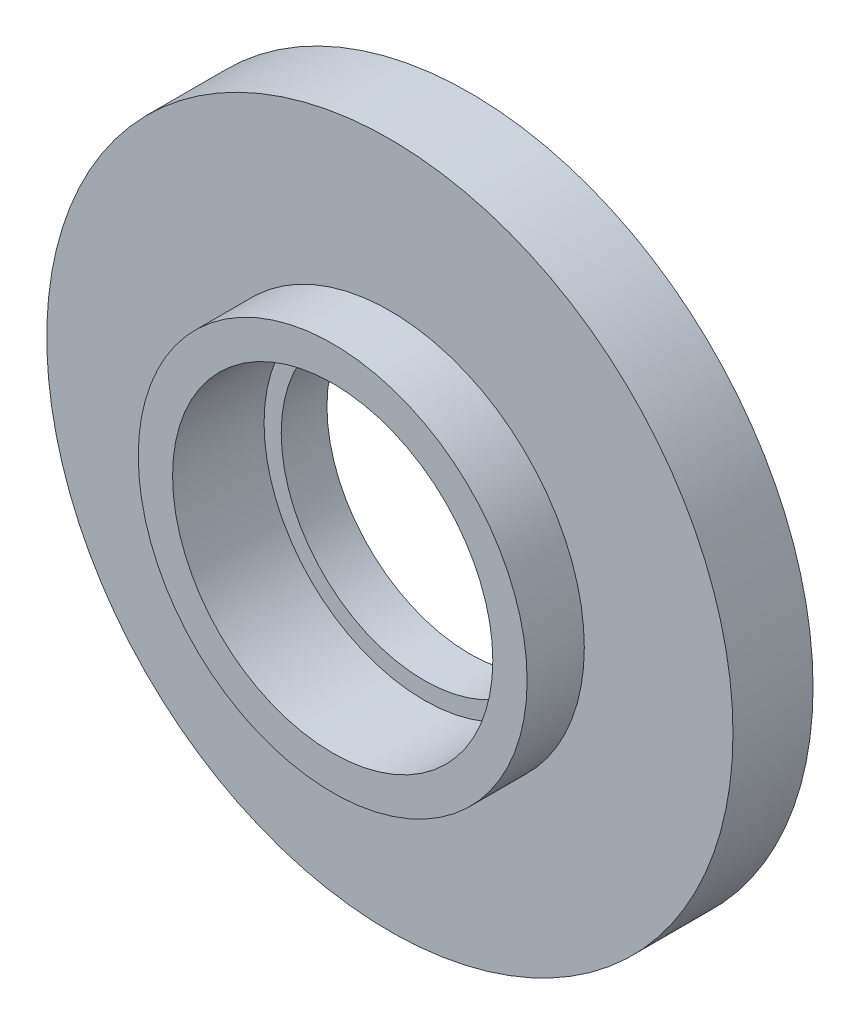
ISO-10303-21;
HEADER;
FILE_DESCRIPTION(('STEP AP214'),'2;1');
FILE_NAME('part.step','',(''),(''),'','','');
FILE_SCHEMA(('AUTOMOTIVE_DESIGN { 1 0 10303 214 1 1 1 1 }'));
ENDSEC;
DATA;
#1=APPLICATION_CONTEXT('core data for automotive mechanical design processes');
#2=APPLICATION_PROTOCOL_DEFINITION('international standard','automotive_design',2000,#1);
#3=PRODUCT_CONTEXT('',#1,'mechanical');
#4=PRODUCT('Part','Part','',(#3));
#5=PRODUCT_RELATED_PRODUCT_CATEGORY('part','',(#4));
#6=PRODUCT_DEFINITION_FORMATION('','',#4);
#7=PRODUCT_DEFINITION_CONTEXT('part definition',#1,'design');
#8=PRODUCT_DEFINITION('design','',#6,#7);
#9=PRODUCT_DEFINITION_SHAPE('','',#8);
#10=(LENGTH_UNIT() NAMED_UNIT(*) SI_UNIT(.MILLI.,.METRE.));
#11=(NAMED_UNIT(*) PLANE_ANGLE_UNIT() SI_UNIT($,.RADIAN.));
#12=(NAMED_UNIT(*) SI_UNIT($,.STERADIAN.) SOLID_ANGLE_UNIT());
#13=UNCERTAINTY_MEASURE_WITH_UNIT(LENGTH_MEASURE(1.E-05),#10,'distance_accuracy_value','');
#14=(GEOMETRIC_REPRESENTATION_CONTEXT(3) GLOBAL_UNCERTAINTY_ASSIGNED_CONTEXT((#13)) GLOBAL_UNIT_ASSIGNED_CONTEXT((#10,
#11,#12)) REPRESENTATION_CONTEXT('',''));
#15=CARTESIAN_POINT('',(0.,0.,0.));
#16=DIRECTION('',(0.,0.,1.));
#17=DIRECTION('',(1.,0.,0.));
#18=AXIS2_PLACEMENT_3D('',#15,#16,#17);
#19=CARTESIAN_POINT('',(0.,0.,0.));
#20=DIRECTION('',(0.,0.,1.));
#21=DIRECTION('',(1.,0.,0.));
#22=AXIS2_PLACEMENT_3D('',#19,#20,#21);
#23=PLANE('',#22);
#24=CARTESIAN_POINT('',(-1.3214635590199E-13,18.,0.));
#25=DIRECTION('',(0.,0.,-1.));
#26=DIRECTION('',(-1.,0.,0.));
#27=AXIS2_PLACEMENT_3D('',#24,#25,#26);
#28=CIRCLE('',#27,2.5);
#29=CARTESIAN_POINT('',(-2.50000000000013,18.,0.));
#30=VERTEX_POINT('',#29);
#31=EDGE_CURVE('E93',#30,#30,#28,.T.);
#32=ORIENTED_EDGE('',*,*,#31,.F.);
#33=EDGE_LOOP('',(#32));
#34=FACE_BOUND('',#33,.T.);
#35=CARTESIAN_POINT('',(15.5884572681197,9.0000000000003,0.));
#36=DIRECTION('',(0.,0.,-1.));
#37=DIRECTION('',(-1.,0.,0.));
#38=AXIS2_PLACEMENT_3D('',#35,#36,#37);
#39=CIRCLE('',#38,2.5);
#40=CARTESIAN_POINT('',(13.0884572681197,9.0000000000003,0.));
#41=VERTEX_POINT('',#40);
#42=EDGE_CURVE('E69',#41,#41,#39,.T.);
#43=ORIENTED_EDGE('',*,*,#42,.F.);
#44=EDGE_LOOP('',(#43));
#45=FACE_BOUND('',#44,.T.);
#46=CARTESIAN_POINT('',(15.58845726812,-8.99999999999974,0.));
#47=DIRECTION('',(0.,0.,-1.));
#48=DIRECTION('',(-1.,0.,0.));
#49=AXIS2_PLACEMENT_3D('',#46,#47,#48);
#50=CIRCLE('',#49,2.5);
#51=CARTESIAN_POINT('',(13.08845726812,-8.99999999999974,0.));
#52=VERTEX_POINT('',#51);
#53=EDGE_CURVE('E67',#52,#52,#50,.T.);
#54=ORIENTED_EDGE('',*,*,#53,.F.);
#55=EDGE_LOOP('',(#54));
#56=FACE_BOUND('',#55,.T.);
#57=CARTESIAN_POINT('',(2.57839684100343E-13,-18.,0.));
#58=DIRECTION('',(0.,0.,-1.));
#59=DIRECTION('',(-1.,0.,0.));
#60=AXIS2_PLACEMENT_3D('',#57,#58,#59);
#61=CIRCLE('',#60,2.5);
#62=CARTESIAN_POINT('',(-2.49999999999974,-18.,0.));
#63=VERTEX_POINT('',#62);
#64=EDGE_CURVE('E77',#63,#63,#61,.T.);
#65=ORIENTED_EDGE('',*,*,#64,.F.);
#66=EDGE_LOOP('',(#65));
#67=FACE_BOUND('',#66,.T.);
#68=CARTESIAN_POINT('',(-15.5884572681198,-9.00000000000019,0.));
#69=DIRECTION('',(0.,0.,-1.));
#70=DIRECTION('',(-1.,0.,0.));
#71=AXIS2_PLACEMENT_3D('',#68,#69,#70);
#72=CIRCLE('',#71,2.5);
#73=CARTESIAN_POINT('',(-18.0884572681198,-9.00000000000019,0.));
#74=VERTEX_POINT('',#73);
#75=EDGE_CURVE('E85',#74,#74,#72,.T.);
#76=ORIENTED_EDGE('',*,*,#75,.F.);
#77=EDGE_LOOP('',(#76));
#78=FACE_BOUND('',#77,.T.);
#79=CARTESIAN_POINT('',(-15.58845726812,8.99999999999985,0.));
#80=DIRECTION('',(0.,0.,-1.));
#81=DIRECTION('',(-1.,0.,0.));
#82=AXIS2_PLACEMENT_3D('',#79,#80,#81);
#83=CIRCLE('',#82,2.5);
#84=CARTESIAN_POINT('',(-18.08845726812,8.99999999999985,0.));
#85=VERTEX_POINT('',#84);
#86=EDGE_CURVE('E86',#85,#85,#83,.T.);
#87=ORIENTED_EDGE('',*,*,#86,.F.);
#88=EDGE_LOOP('',(#87));
#89=FACE_BOUND('',#88,.T.);
#90=CARTESIAN_POINT('',(0.,0.,0.));
#91=DIRECTION('',(0.,0.,-1.));
#92=DIRECTION('',(-1.,0.,0.));
#93=AXIS2_PLACEMENT_3D('',#90,#91,#92);
#94=CIRCLE('',#93,12.5);
#95=CARTESIAN_POINT('',(-12.5,0.,0.));
#96=VERTEX_POINT('',#95);
#97=EDGE_CURVE('E64',#96,#96,#94,.T.);
#98=ORIENTED_EDGE('',*,*,#97,.F.);
#99=EDGE_LOOP('',(#98));
#100=FACE_BOUND('',#99,.T.);
#101=CARTESIAN_POINT('',(0.,0.,0.));
#102=DIRECTION('',(0.,0.,1.));
#103=DIRECTION('',(1.,0.,0.));
#104=AXIS2_PLACEMENT_3D('',#101,#102,#103);
#105=CIRCLE('',#104,30.);
#106=CARTESIAN_POINT('',(30.,0.,0.));
#107=VERTEX_POINT('',#106);
#108=EDGE_CURVE('E10',#107,#107,#105,.T.);
#109=ORIENTED_EDGE('',*,*,#108,.F.);
#110=EDGE_LOOP('',(#109));
#111=FACE_BOUND('',#110,.T.);
#112=ADVANCED_FACE('F40',(#34,#45,#56,#67,#78,#89,#100,#111),#23,.F.);
#113=CARTESIAN_POINT('',(0.,0.,12.));
#114=DIRECTION('',(0.,0.,1.));
#115=DIRECTION('',(1.,0.,0.));
#116=AXIS2_PLACEMENT_3D('',#113,#114,#115);
#117=CYLINDRICAL_SURFACE('',#116,30.);
#118=CARTESIAN_POINT('',(0.,0.,7.));
#119=DIRECTION('',(0.,0.,1.));
#120=DIRECTION('',(1.,0.,0.));
#121=AXIS2_PLACEMENT_3D('',#118,#119,#120);
#122=CIRCLE('',#121,30.);
#123=CARTESIAN_POINT('',(30.,0.,7.));
#124=VERTEX_POINT('',#123);
#125=EDGE_CURVE('E42',#124,#124,#122,.T.);
#126=ORIENTED_EDGE('',*,*,#125,.F.);
#127=EDGE_LOOP('',(#126));
#128=FACE_BOUND('',#127,.T.);
#129=ORIENTED_EDGE('',*,*,#108,.T.);
#130=EDGE_LOOP('',(#129));
#131=FACE_BOUND('',#130,.T.);
#132=ADVANCED_FACE('F114',(#128,#131),#117,.T.);
#133=CARTESIAN_POINT('',(-30.,0.,7.));
#134=DIRECTION('',(0.,0.,-1.));
#135=DIRECTION('',(-1.,0.,0.));
#136=AXIS2_PLACEMENT_3D('',#133,#134,#135);
#137=PLANE('',#136);
#138=CARTESIAN_POINT('',(0.,0.,7.));
#139=DIRECTION('',(0.,0.,1.));
#140=DIRECTION('',(1.,0.,0.));
#141=AXIS2_PLACEMENT_3D('',#138,#139,#140);
#142=CIRCLE('',#141,17.);
#143=CARTESIAN_POINT('',(17.,0.,7.));
#144=VERTEX_POINT('',#143);
#145=EDGE_CURVE('E48',#144,#144,#142,.T.);
#146=ORIENTED_EDGE('',*,*,#145,.F.);
#147=EDGE_LOOP('',(#146));
#148=FACE_BOUND('',#147,.T.);
#149=ORIENTED_EDGE('',*,*,#125,.T.);
#150=EDGE_LOOP('',(#149));
#151=FACE_BOUND('',#150,.T.);
#152=ADVANCED_FACE('F158',(#148,#151),#137,.F.);
#153=CARTESIAN_POINT('',(0.,0.,12.));
#154=DIRECTION('',(0.,0.,1.));
#155=DIRECTION('',(1.,0.,0.));
#156=AXIS2_PLACEMENT_3D('',#153,#154,#155);
#157=CYLINDRICAL_SURFACE('',#156,17.);
#158=CARTESIAN_POINT('',(0.,0.,12.));
#159=DIRECTION('',(0.,0.,1.));
#160=DIRECTION('',(1.,0.,0.));
#161=AXIS2_PLACEMENT_3D('',#158,#159,#160);
#162=CIRCLE('',#161,17.);
#163=CARTESIAN_POINT('',(17.,0.,12.));
#164=VERTEX_POINT('',#163);
#165=EDGE_CURVE('E52',#164,#164,#162,.T.);
#166=ORIENTED_EDGE('',*,*,#165,.F.);
#167=EDGE_LOOP('',(#166));
#168=FACE_BOUND('',#167,.T.);
#169=ORIENTED_EDGE('',*,*,#145,.T.);
#170=EDGE_LOOP('',(#169));
#171=FACE_BOUND('',#170,.T.);
#172=ADVANCED_FACE('F152',(#168,#171),#157,.T.);
#173=CARTESIAN_POINT('',(-17.,0.,12.));
#174=DIRECTION('',(0.,0.,-1.));
#175=DIRECTION('',(-1.,0.,0.));
#176=AXIS2_PLACEMENT_3D('',#173,#174,#175);
#177=PLANE('',#176);
#178=CARTESIAN_POINT('',(0.,0.,12.));
#179=DIRECTION('',(0.,0.,1.));
#180=DIRECTION('',(1.,0.,0.));
#181=AXIS2_PLACEMENT_3D('',#178,#179,#180);
#182=CIRCLE('',#181,14.);
#183=CARTESIAN_POINT('',(14.,0.,12.));
#184=VERTEX_POINT('',#183);
#185=EDGE_CURVE('E60',#184,#184,#182,.T.);
#186=ORIENTED_EDGE('',*,*,#185,.F.);
#187=EDGE_LOOP('',(#186));
#188=FACE_BOUND('',#187,.T.);
#189=ORIENTED_EDGE('',*,*,#165,.T.);
#190=EDGE_LOOP('',(#189));
#191=FACE_BOUND('',#190,.T.);
#192=ADVANCED_FACE('F147',(#188,#191),#177,.F.);
#193=CARTESIAN_POINT('',(0.,0.,4.));
#194=DIRECTION('',(0.,0.,1.));
#195=DIRECTION('',(1.,0.,0.));
#196=AXIS2_PLACEMENT_3D('',#193,#194,#195);
#197=CYLINDRICAL_SURFACE('',#196,14.);
#198=CARTESIAN_POINT('',(0.,0.,4.));
#199=DIRECTION('',(0.,0.,1.));
#200=DIRECTION('',(1.,0.,0.));
#201=AXIS2_PLACEMENT_3D('',#198,#199,#200);
#202=CIRCLE('',#201,14.);
#203=CARTESIAN_POINT('',(14.,0.,4.));
#204=VERTEX_POINT('',#203);
#205=EDGE_CURVE('E57',#204,#204,#202,.T.);
#206=ORIENTED_EDGE('',*,*,#205,.F.);
#207=EDGE_LOOP('',(#206));
#208=FACE_BOUND('',#207,.T.);
#209=ORIENTED_EDGE('',*,*,#185,.T.);
#210=EDGE_LOOP('',(#209));
#211=FACE_BOUND('',#210,.T.);
#212=ADVANCED_FACE('F139',(#208,#211),#197,.F.);
#213=CARTESIAN_POINT('',(0.,0.,4.));
#214=DIRECTION('',(0.,0.,1.));
#215=DIRECTION('',(1.,0.,0.));
#216=AXIS2_PLACEMENT_3D('',#213,#214,#215);
#217=PLANE('',#216);
#218=CARTESIAN_POINT('',(0.,0.,4.));
#219=DIRECTION('',(0.,0.,1.));
#220=DIRECTION('',(1.,0.,0.));
#221=AXIS2_PLACEMENT_3D('',#218,#219,#220);
#222=CIRCLE('',#221,12.5);
#223=CARTESIAN_POINT('',(12.5,0.,4.));
#224=VERTEX_POINT('',#223);
#225=EDGE_CURVE('E37',#224,#224,#222,.T.);
#226=ORIENTED_EDGE('',*,*,#225,.F.);
#227=EDGE_LOOP('',(#226));
#228=FACE_BOUND('',#227,.T.);
#229=ORIENTED_EDGE('',*,*,#205,.T.);
#230=EDGE_LOOP('',(#229));
#231=FACE_BOUND('',#230,.T.);
#232=ADVANCED_FACE('F128',(#228,#231),#217,.T.);
#233=CARTESIAN_POINT('',(0.,0.,8.1));
#234=DIRECTION('',(0.,0.,-1.));
#235=DIRECTION('',(-1.,0.,0.));
#236=AXIS2_PLACEMENT_3D('',#233,#234,#235);
#237=CYLINDRICAL_SURFACE('',#236,12.5);
#238=ORIENTED_EDGE('',*,*,#225,.T.);
#239=EDGE_LOOP('',(#238));
#240=FACE_BOUND('',#239,.T.);
#241=ORIENTED_EDGE('',*,*,#97,.T.);
#242=EDGE_LOOP('',(#241));
#243=FACE_BOUND('',#242,.T.);
#244=ADVANCED_FACE('F130',(#240,#243),#237,.F.);
#245=CARTESIAN_POINT('',(-15.58845726812,8.99999999999985,3.));
#246=DIRECTION('',(0.,0.,-1.));
#247=DIRECTION('',(-1.,0.,0.));
#248=AXIS2_PLACEMENT_3D('',#245,#246,#247);
#249=CYLINDRICAL_SURFACE('',#248,2.5);
#250=CARTESIAN_POINT('',(-15.58845726812,8.99999999999985,3.));
#251=DIRECTION('',(0.,0.,-1.));
#252=DIRECTION('',(-1.,0.,0.));
#253=AXIS2_PLACEMENT_3D('',#250,#251,#252);
#254=CIRCLE('',#253,2.5);
#255=CARTESIAN_POINT('',(-18.08845726812,8.99999999999985,3.));
#256=VERTEX_POINT('',#255);
#257=EDGE_CURVE('E84',#256,#256,#254,.T.);
#258=ORIENTED_EDGE('',*,*,#257,.F.);
#259=EDGE_LOOP('',(#258));
#260=FACE_BOUND('',#259,.T.);
#261=ORIENTED_EDGE('',*,*,#86,.T.);
#262=EDGE_LOOP('',(#261));
#263=FACE_BOUND('',#262,.T.);
#264=ADVANCED_FACE('F129',(#260,#263),#249,.F.);
#265=CARTESIAN_POINT('',(-15.58845726812,8.99999999999985,3.));
#266=DIRECTION('',(0.,0.,-1.));
#267=DIRECTION('',(-1.,0.,0.));
#268=AXIS2_PLACEMENT_3D('',#265,#266,#267);
#269=PLANE('',#268);
#270=ORIENTED_EDGE('',*,*,#257,.T.);
#271=EDGE_LOOP('',(#270));
#272=FACE_BOUND('',#271,.T.);
#273=ADVANCED_FACE('F140',(#272),#269,.T.);
#274=CARTESIAN_POINT('',(-15.5884572681198,-9.00000000000019,3.));
#275=DIRECTION('',(0.,0.,-1.));
#276=DIRECTION('',(-1.,0.,0.));
#277=AXIS2_PLACEMENT_3D('',#274,#275,#276);
#278=CYLINDRICAL_SURFACE('',#277,2.5);
#279=CARTESIAN_POINT('',(-15.5884572681198,-9.00000000000019,3.));
#280=DIRECTION('',(0.,0.,-1.));
#281=DIRECTION('',(-1.,0.,0.));
#282=AXIS2_PLACEMENT_3D('',#279,#280,#281);
#283=CIRCLE('',#282,2.5);
#284=CARTESIAN_POINT('',(-18.0884572681198,-9.00000000000019,3.));
#285=VERTEX_POINT('',#284);
#286=EDGE_CURVE('E76',#285,#285,#283,.T.);
#287=ORIENTED_EDGE('',*,*,#286,.F.);
#288=EDGE_LOOP('',(#287));
#289=FACE_BOUND('',#288,.T.);
#290=ORIENTED_EDGE('',*,*,#75,.T.);
#291=EDGE_LOOP('',(#290));
#292=FACE_BOUND('',#291,.T.);
#293=ADVANCED_FACE('F212',(#289,#292),#278,.F.);
#294=CARTESIAN_POINT('',(-15.5884572681198,-9.00000000000019,3.));
#295=DIRECTION('',(0.,0.,-1.));
#296=DIRECTION('',(-1.,0.,0.));
#297=AXIS2_PLACEMENT_3D('',#294,#295,#296);
#298=PLANE('',#297);
#299=ORIENTED_EDGE('',*,*,#286,.T.);
#300=EDGE_LOOP('',(#299));
#301=FACE_BOUND('',#300,.T.);
#302=ADVANCED_FACE('F221',(#301),#298,.T.);
#303=CARTESIAN_POINT('',(2.57839684100343E-13,-18.,3.));
#304=DIRECTION('',(0.,0.,-1.));
#305=DIRECTION('',(-1.,0.,0.));
#306=AXIS2_PLACEMENT_3D('',#303,#304,#305);
#307=CYLINDRICAL_SURFACE('',#306,2.5);
#308=CARTESIAN_POINT('',(2.57839684100343E-13,-18.,3.));
#309=DIRECTION('',(0.,0.,-1.));
#310=DIRECTION('',(-1.,0.,0.));
#311=AXIS2_PLACEMENT_3D('',#308,#309,#310);
#312=CIRCLE('',#311,2.5);
#313=CARTESIAN_POINT('',(-2.49999999999974,-18.,3.));
#314=VERTEX_POINT('',#313);
#315=EDGE_CURVE('E71',#314,#314,#312,.T.);
#316=ORIENTED_EDGE('',*,*,#315,.F.);
#317=EDGE_LOOP('',(#316));
#318=FACE_BOUND('',#317,.T.);
#319=ORIENTED_EDGE('',*,*,#64,.T.);
#320=EDGE_LOOP('',(#319));
#321=FACE_BOUND('',#320,.T.);
#322=ADVANCED_FACE('F232',(#318,#321),#307,.F.);
#323=CARTESIAN_POINT('',(2.57839684100343E-13,-18.,3.));
#324=DIRECTION('',(0.,0.,-1.));
#325=DIRECTION('',(-1.,0.,0.));
#326=AXIS2_PLACEMENT_3D('',#323,#324,#325);
#327=PLANE('',#326);
#328=ORIENTED_EDGE('',*,*,#315,.T.);
#329=EDGE_LOOP('',(#328));
#330=FACE_BOUND('',#329,.T.);
#331=ADVANCED_FACE('F241',(#330),#327,.T.);
#332=CARTESIAN_POINT('',(15.58845726812,-8.99999999999974,3.));
#333=DIRECTION('',(0.,0.,-1.));
#334=DIRECTION('',(-1.,0.,0.));
#335=AXIS2_PLACEMENT_3D('',#332,#333,#334);
#336=CYLINDRICAL_SURFACE('',#335,2.5);
#337=CARTESIAN_POINT('',(15.58845726812,-8.99999999999974,3.));
#338=DIRECTION('',(0.,0.,-1.));
#339=DIRECTION('',(-1.,0.,0.));
#340=AXIS2_PLACEMENT_3D('',#337,#338,#339);
#341=CIRCLE('',#340,2.5);
#342=CARTESIAN_POINT('',(13.08845726812,-8.99999999999974,3.));
#343=VERTEX_POINT('',#342);
#344=EDGE_CURVE('E68',#343,#343,#341,.T.);
#345=ORIENTED_EDGE('',*,*,#344,.F.);
#346=EDGE_LOOP('',(#345));
#347=FACE_BOUND('',#346,.T.);
#348=ORIENTED_EDGE('',*,*,#53,.T.);
#349=EDGE_LOOP('',(#348));
#350=FACE_BOUND('',#349,.T.);
#351=ADVANCED_FACE('F255',(#347,#350),#336,.F.);
#352=CARTESIAN_POINT('',(15.58845726812,-8.99999999999974,3.));
#353=DIRECTION('',(0.,0.,-1.));
#354=DIRECTION('',(-1.,0.,0.));
#355=AXIS2_PLACEMENT_3D('',#352,#353,#354);
#356=PLANE('',#355);
#357=ORIENTED_EDGE('',*,*,#344,.T.);
#358=EDGE_LOOP('',(#357));
#359=FACE_BOUND('',#358,.T.);
#360=ADVANCED_FACE('F144',(#359),#356,.T.);
#361=CARTESIAN_POINT('',(15.5884572681197,9.0000000000003,3.));
#362=DIRECTION('',(0.,0.,-1.));
#363=DIRECTION('',(-1.,0.,0.));
#364=AXIS2_PLACEMENT_3D('',#361,#362,#363);
#365=CYLINDRICAL_SURFACE('',#364,2.5);
#366=CARTESIAN_POINT('',(15.5884572681197,9.0000000000003,3.));
#367=DIRECTION('',(0.,0.,-1.));
#368=DIRECTION('',(-1.,0.,0.));
#369=AXIS2_PLACEMENT_3D('',#366,#367,#368);
#370=CIRCLE('',#369,2.5);
#371=CARTESIAN_POINT('',(13.0884572681197,9.0000000000003,3.));
#372=VERTEX_POINT('',#371);
#373=EDGE_CURVE('E95',#372,#372,#370,.T.);
#374=ORIENTED_EDGE('',*,*,#373,.F.);
#375=EDGE_LOOP('',(#374));
#376=FACE_BOUND('',#375,.T.);
#377=ORIENTED_EDGE('',*,*,#42,.T.);
#378=EDGE_LOOP('',(#377));
#379=FACE_BOUND('',#378,.T.);
#380=ADVANCED_FACE('F275',(#376,#379),#365,.F.);
#381=CARTESIAN_POINT('',(15.5884572681197,9.0000000000003,3.));
#382=DIRECTION('',(0.,0.,-1.));
#383=DIRECTION('',(-1.,0.,0.));
#384=AXIS2_PLACEMENT_3D('',#381,#382,#383);
#385=PLANE('',#384);
#386=ORIENTED_EDGE('',*,*,#373,.T.);
#387=EDGE_LOOP('',(#386));
#388=FACE_BOUND('',#387,.T.);
#389=ADVANCED_FACE('F110',(#388),#385,.T.);
#390=CARTESIAN_POINT('',(-1.3214635590199E-13,18.,3.));
#391=DIRECTION('',(0.,0.,-1.));
#392=DIRECTION('',(-1.,0.,0.));
#393=AXIS2_PLACEMENT_3D('',#390,#391,#392);
#394=CYLINDRICAL_SURFACE('',#393,2.5);
#395=CARTESIAN_POINT('',(-1.3214635590199E-13,18.,3.));
#396=DIRECTION('',(0.,0.,-1.));
#397=DIRECTION('',(-1.,0.,0.));
#398=AXIS2_PLACEMENT_3D('',#395,#396,#397);
#399=CIRCLE('',#398,2.5);
#400=CARTESIAN_POINT('',(-2.50000000000013,18.,3.));
#401=VERTEX_POINT('',#400);
#402=EDGE_CURVE('E63',#401,#401,#399,.T.);
#403=ORIENTED_EDGE('',*,*,#402,.F.);
#404=EDGE_LOOP('',(#403));
#405=FACE_BOUND('',#404,.T.);
#406=ORIENTED_EDGE('',*,*,#31,.T.);
#407=EDGE_LOOP('',(#406));
#408=FACE_BOUND('',#407,.T.);
#409=ADVANCED_FACE('F102',(#405,#408),#394,.F.);
#410=CARTESIAN_POINT('',(-1.3214635590199E-13,18.,3.));
#411=DIRECTION('',(0.,0.,-1.));
#412=DIRECTION('',(-1.,0.,0.));
#413=AXIS2_PLACEMENT_3D('',#410,#411,#412);
#414=PLANE('',#413);
#415=ORIENTED_EDGE('',*,*,#402,.T.);
#416=EDGE_LOOP('',(#415));
#417=FACE_BOUND('',#416,.T.);
#418=ADVANCED_FACE('F105',(#417),#414,.T.);
#419=CLOSED_SHELL('',(#112,#132,#152,#172,#192,#212,#232,#244,#264,#273,#293,#302,#322,#331,
#351,#360,#380,#389,#409,#418));
#420=MANIFOLD_SOLID_BREP('B2',#419);
#421=ADVANCED_BREP_SHAPE_REPRESENTATION('',(#18,#420),#14);
#422=SHAPE_DEFINITION_REPRESENTATION(#9,#421);
ENDSEC;
END-ISO-10303-21;
